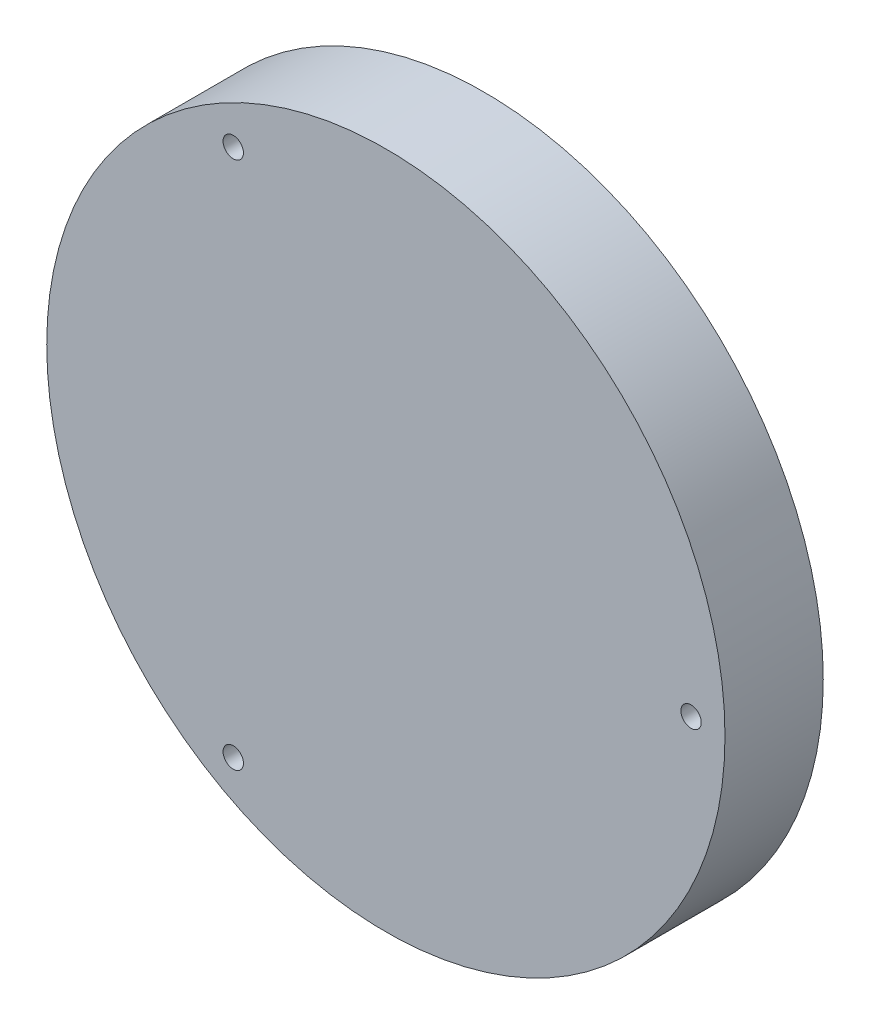
ISO-10303-21;
HEADER;
FILE_DESCRIPTION(('STEP AP214'),'2;1');
FILE_NAME('part.step','',(''),(''),'','','');
FILE_SCHEMA(('AUTOMOTIVE_DESIGN { 1 0 10303 214 1 1 1 1 }'));
ENDSEC;
DATA;
#1=APPLICATION_CONTEXT('core data for automotive mechanical design processes');
#2=APPLICATION_PROTOCOL_DEFINITION('international standard','automotive_design',2000,#1);
#3=PRODUCT_CONTEXT('',#1,'mechanical');
#4=PRODUCT('Part','Part','',(#3));
#5=PRODUCT_RELATED_PRODUCT_CATEGORY('part','',(#4));
#6=PRODUCT_DEFINITION_FORMATION('','',#4);
#7=PRODUCT_DEFINITION_CONTEXT('part definition',#1,'design');
#8=PRODUCT_DEFINITION('design','',#6,#7);
#9=PRODUCT_DEFINITION_SHAPE('','',#8);
#10=(LENGTH_UNIT() NAMED_UNIT(*) SI_UNIT(.MILLI.,.METRE.));
#11=(NAMED_UNIT(*) PLANE_ANGLE_UNIT() SI_UNIT($,.RADIAN.));
#12=(NAMED_UNIT(*) SI_UNIT($,.STERADIAN.) SOLID_ANGLE_UNIT());
#13=UNCERTAINTY_MEASURE_WITH_UNIT(LENGTH_MEASURE(1.E-05),#10,'distance_accuracy_value','');
#14=(GEOMETRIC_REPRESENTATION_CONTEXT(3) GLOBAL_UNCERTAINTY_ASSIGNED_CONTEXT((#13)) GLOBAL_UNIT_ASSIGNED_CONTEXT((#10,
#11,#12)) REPRESENTATION_CONTEXT('',''));
#15=CARTESIAN_POINT('',(0.,0.,0.));
#16=DIRECTION('',(0.,0.,1.));
#17=DIRECTION('',(1.,0.,0.));
#18=AXIS2_PLACEMENT_3D('',#15,#16,#17);
#19=CARTESIAN_POINT('',(-22.5,38.9711431702997,14.4886317681065));
#20=DIRECTION('',(0.,0.,-1.));
#21=DIRECTION('',(-1.,0.,0.));
#22=AXIS2_PLACEMENT_3D('',#19,#20,#21);
#23=CYLINDRICAL_SURFACE('',#22,1.5);
#24=CARTESIAN_POINT('',(-22.5,38.9711431702997,14.4886317681065));
#25=DIRECTION('',(0.,0.,1.));
#26=DIRECTION('',(1.,0.,0.));
#27=AXIS2_PLACEMENT_3D('',#24,#25,#26);
#28=CIRCLE('',#27,1.5);
#29=CARTESIAN_POINT('',(-21.,38.9711431702997,14.4886317681065));
#30=VERTEX_POINT('',#29);
#31=EDGE_CURVE('E44',#30,#30,#28,.T.);
#32=ORIENTED_EDGE('',*,*,#31,.T.);
#33=EDGE_LOOP('',(#32));
#34=FACE_BOUND('',#33,.T.);
#35=CARTESIAN_POINT('',(-22.5,38.9711431702997,0.));
#36=DIRECTION('',(0.,0.,1.));
#37=DIRECTION('',(1.,0.,0.));
#38=AXIS2_PLACEMENT_3D('',#35,#36,#37);
#39=CIRCLE('',#38,1.5);
#40=CARTESIAN_POINT('',(-21.,38.9711431702997,0.));
#41=VERTEX_POINT('',#40);
#42=EDGE_CURVE('E56',#41,#41,#39,.T.);
#43=ORIENTED_EDGE('',*,*,#42,.F.);
#44=EDGE_LOOP('',(#43));
#45=FACE_BOUND('',#44,.T.);
#46=ADVANCED_FACE('F40',(#34,#45),#23,.F.);
#47=CARTESIAN_POINT('',(-22.5,-38.9711431702997,14.4886317681065));
#48=DIRECTION('',(0.,0.,-1.));
#49=DIRECTION('',(-1.,0.,0.));
#50=AXIS2_PLACEMENT_3D('',#47,#48,#49);
#51=CYLINDRICAL_SURFACE('',#50,1.5);
#52=CARTESIAN_POINT('',(-22.5,-38.9711431702997,14.4886317681065));
#53=DIRECTION('',(0.,0.,1.));
#54=DIRECTION('',(1.,0.,0.));
#55=AXIS2_PLACEMENT_3D('',#52,#53,#54);
#56=CIRCLE('',#55,1.5);
#57=CARTESIAN_POINT('',(-21.,-38.9711431702997,14.4886317681065));
#58=VERTEX_POINT('',#57);
#59=EDGE_CURVE('E49',#58,#58,#56,.T.);
#60=ORIENTED_EDGE('',*,*,#59,.T.);
#61=EDGE_LOOP('',(#60));
#62=FACE_BOUND('',#61,.T.);
#63=CARTESIAN_POINT('',(-22.5,-38.9711431702997,0.));
#64=DIRECTION('',(0.,0.,1.));
#65=DIRECTION('',(1.,0.,0.));
#66=AXIS2_PLACEMENT_3D('',#63,#64,#65);
#67=CIRCLE('',#66,1.5);
#68=CARTESIAN_POINT('',(-21.,-38.9711431702997,0.));
#69=VERTEX_POINT('',#68);
#70=EDGE_CURVE('E60',#69,#69,#67,.T.);
#71=ORIENTED_EDGE('',*,*,#70,.F.);
#72=EDGE_LOOP('',(#71));
#73=FACE_BOUND('',#72,.T.);
#74=ADVANCED_FACE('F73',(#62,#73),#51,.F.);
#75=CARTESIAN_POINT('',(45.,0.,14.4886317681065));
#76=DIRECTION('',(0.,0.,-1.));
#77=DIRECTION('',(-1.,0.,0.));
#78=AXIS2_PLACEMENT_3D('',#75,#76,#77);
#79=CYLINDRICAL_SURFACE('',#78,1.5);
#80=CARTESIAN_POINT('',(45.,0.,14.4886317681065));
#81=DIRECTION('',(0.,0.,1.));
#82=DIRECTION('',(1.,0.,0.));
#83=AXIS2_PLACEMENT_3D('',#80,#81,#82);
#84=CIRCLE('',#83,1.5);
#85=CARTESIAN_POINT('',(46.5,0.,14.4886317681065));
#86=VERTEX_POINT('',#85);
#87=EDGE_CURVE('E63',#86,#86,#84,.T.);
#88=ORIENTED_EDGE('',*,*,#87,.T.);
#89=EDGE_LOOP('',(#88));
#90=FACE_BOUND('',#89,.T.);
#91=CARTESIAN_POINT('',(45.,0.,0.));
#92=DIRECTION('',(0.,0.,1.));
#93=DIRECTION('',(1.,0.,0.));
#94=AXIS2_PLACEMENT_3D('',#91,#92,#93);
#95=CIRCLE('',#94,1.5);
#96=CARTESIAN_POINT('',(46.5,0.,0.));
#97=VERTEX_POINT('',#96);
#98=EDGE_CURVE('E53',#97,#97,#95,.T.);
#99=ORIENTED_EDGE('',*,*,#98,.F.);
#100=EDGE_LOOP('',(#99));
#101=FACE_BOUND('',#100,.T.);
#102=ADVANCED_FACE('F39',(#90,#101),#79,.F.);
#103=CARTESIAN_POINT('',(0.,0.,14.4886317681065));
#104=DIRECTION('',(0.,0.,-1.));
#105=DIRECTION('',(-1.,0.,0.));
#106=AXIS2_PLACEMENT_3D('',#103,#104,#105);
#107=CYLINDRICAL_SURFACE('',#106,50.);
#108=CARTESIAN_POINT('',(0.,0.,14.4886317681065));
#109=DIRECTION('',(0.,0.,1.));
#110=DIRECTION('',(1.,0.,0.));
#111=AXIS2_PLACEMENT_3D('',#108,#109,#110);
#112=CIRCLE('',#111,50.);
#113=CARTESIAN_POINT('',(50.,0.,14.4886317681065));
#114=VERTEX_POINT('',#113);
#115=EDGE_CURVE('E10',#114,#114,#112,.T.);
#116=ORIENTED_EDGE('',*,*,#115,.F.);
#117=EDGE_LOOP('',(#116));
#118=FACE_BOUND('',#117,.T.);
#119=CARTESIAN_POINT('',(0.,0.,0.));
#120=DIRECTION('',(0.,0.,1.));
#121=DIRECTION('',(1.,0.,0.));
#122=AXIS2_PLACEMENT_3D('',#119,#120,#121);
#123=CIRCLE('',#122,50.);
#124=CARTESIAN_POINT('',(50.,0.,0.));
#125=VERTEX_POINT('',#124);
#126=EDGE_CURVE('E41',#125,#125,#123,.T.);
#127=ORIENTED_EDGE('',*,*,#126,.T.);
#128=EDGE_LOOP('',(#127));
#129=FACE_BOUND('',#128,.T.);
#130=ADVANCED_FACE('F83',(#118,#129),#107,.T.);
#131=CARTESIAN_POINT('',(0.,0.,14.4886317681065));
#132=DIRECTION('',(0.,0.,1.));
#133=DIRECTION('',(1.,0.,0.));
#134=AXIS2_PLACEMENT_3D('',#131,#132,#133);
#135=PLANE('',#134);
#136=ORIENTED_EDGE('',*,*,#87,.F.);
#137=EDGE_LOOP('',(#136));
#138=FACE_BOUND('',#137,.T.);
#139=ORIENTED_EDGE('',*,*,#59,.F.);
#140=EDGE_LOOP('',(#139));
#141=FACE_BOUND('',#140,.T.);
#142=ORIENTED_EDGE('',*,*,#31,.F.);
#143=EDGE_LOOP('',(#142));
#144=FACE_BOUND('',#143,.T.);
#145=ORIENTED_EDGE('',*,*,#115,.T.);
#146=EDGE_LOOP('',(#145));
#147=FACE_BOUND('',#146,.T.);
#148=ADVANCED_FACE('F77',(#138,#141,#144,#147),#135,.T.);
#149=CARTESIAN_POINT('',(0.,0.,0.));
#150=DIRECTION('',(0.,0.,1.));
#151=DIRECTION('',(1.,0.,0.));
#152=AXIS2_PLACEMENT_3D('',#149,#150,#151);
#153=PLANE('',#152);
#154=ORIENTED_EDGE('',*,*,#98,.T.);
#155=EDGE_LOOP('',(#154));
#156=FACE_BOUND('',#155,.T.);
#157=ORIENTED_EDGE('',*,*,#70,.T.);
#158=EDGE_LOOP('',(#157));
#159=FACE_BOUND('',#158,.T.);
#160=ORIENTED_EDGE('',*,*,#42,.T.);
#161=EDGE_LOOP('',(#160));
#162=FACE_BOUND('',#161,.T.);
#163=ORIENTED_EDGE('',*,*,#126,.F.);
#164=EDGE_LOOP('',(#163));
#165=FACE_BOUND('',#164,.T.);
#166=ADVANCED_FACE('F79',(#156,#159,#162,#165),#153,.F.);
#167=CLOSED_SHELL('',(#46,#74,#102,#130,#148,#166));
#168=MANIFOLD_SOLID_BREP('B2',#167);
#169=ADVANCED_BREP_SHAPE_REPRESENTATION('',(#18,#168),#14);
#170=SHAPE_DEFINITION_REPRESENTATION(#9,#169);
ENDSEC;
END-ISO-10303-21;
